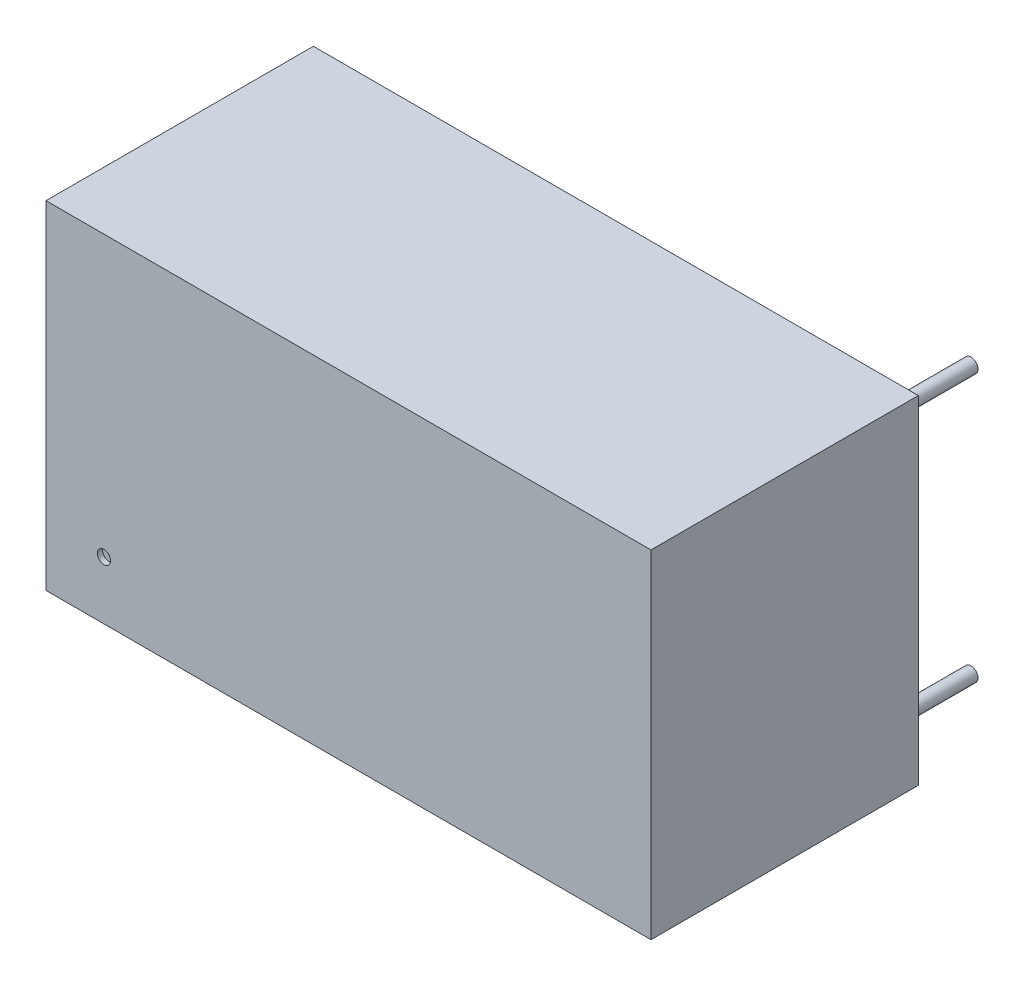
ISO-10303-21;
HEADER;
FILE_DESCRIPTION(('STEP AP214'),'2;1');
FILE_NAME('part.step','',(''),(''),'','','');
FILE_SCHEMA(('AUTOMOTIVE_DESIGN { 1 0 10303 214 1 1 1 1 }'));
ENDSEC;
DATA;
#1=APPLICATION_CONTEXT('core data for automotive mechanical design processes');
#2=APPLICATION_PROTOCOL_DEFINITION('international standard','automotive_design',2000,#1);
#3=PRODUCT_CONTEXT('',#1,'mechanical');
#4=PRODUCT('Part','Part','',(#3));
#5=PRODUCT_RELATED_PRODUCT_CATEGORY('part','',(#4));
#6=PRODUCT_DEFINITION_FORMATION('','',#4);
#7=PRODUCT_DEFINITION_CONTEXT('part definition',#1,'design');
#8=PRODUCT_DEFINITION('design','',#6,#7);
#9=PRODUCT_DEFINITION_SHAPE('','',#8);
#10=(LENGTH_UNIT() NAMED_UNIT(*) SI_UNIT(.MILLI.,.METRE.));
#11=(NAMED_UNIT(*) PLANE_ANGLE_UNIT() SI_UNIT($,.RADIAN.));
#12=(NAMED_UNIT(*) SI_UNIT($,.STERADIAN.) SOLID_ANGLE_UNIT());
#13=UNCERTAINTY_MEASURE_WITH_UNIT(LENGTH_MEASURE(1.E-05),#10,'distance_accuracy_value','');
#14=(GEOMETRIC_REPRESENTATION_CONTEXT(3) GLOBAL_UNCERTAINTY_ASSIGNED_CONTEXT((#13)) GLOBAL_UNIT_ASSIGNED_CONTEXT((#10,
#11,#12)) REPRESENTATION_CONTEXT('',''));
#15=CARTESIAN_POINT('',(0.,0.,0.));
#16=DIRECTION('',(0.,0.,1.));
#17=DIRECTION('',(1.,0.,0.));
#18=AXIS2_PLACEMENT_3D('',#15,#16,#17);
#19=CARTESIAN_POINT('',(0.,0.,15.24));
#20=DIRECTION('',(1.,0.,0.));
#21=DIRECTION('',(0.,0.,-1.));
#22=AXIS2_PLACEMENT_3D('',#19,#20,#21);
#23=PLANE('',#22);
#24=DIRECTION('',(0.,-1.,0.));
#25=VECTOR('',#24,1.);
#26=CARTESIAN_POINT('',(0.,0.,0.));
#27=LINE('',#26,#25);
#28=CARTESIAN_POINT('',(0.,19.24,0.));
#29=VERTEX_POINT('',#28);
#30=CARTESIAN_POINT('',(0.,0.,0.));
#31=VERTEX_POINT('',#30);
#32=EDGE_CURVE('E100',#29,#31,#27,.T.);
#33=ORIENTED_EDGE('',*,*,#32,.T.);
#34=DIRECTION('',(0.,0.,-1.));
#35=VECTOR('',#34,1.);
#36=CARTESIAN_POINT('',(0.,0.,15.24));
#37=LINE('',#36,#35);
#38=CARTESIAN_POINT('',(0.,0.,15.24));
#39=VERTEX_POINT('',#38);
#40=EDGE_CURVE('E11',#39,#31,#37,.T.);
#41=ORIENTED_EDGE('',*,*,#40,.F.);
#42=DIRECTION('',(0.,-1.,0.));
#43=VECTOR('',#42,1.);
#44=CARTESIAN_POINT('',(0.,0.,15.24));
#45=LINE('',#44,#43);
#46=CARTESIAN_POINT('',(0.,19.24,15.24));
#47=VERTEX_POINT('',#46);
#48=EDGE_CURVE('E88',#47,#39,#45,.T.);
#49=ORIENTED_EDGE('',*,*,#48,.F.);
#50=DIRECTION('',(0.,0.,-1.));
#51=VECTOR('',#50,1.);
#52=CARTESIAN_POINT('',(0.,19.24,15.24));
#53=LINE('',#52,#51);
#54=EDGE_CURVE('E96',#47,#29,#53,.T.);
#55=ORIENTED_EDGE('',*,*,#54,.T.);
#56=EDGE_LOOP('',(#33,#41,#49,#55));
#57=FACE_BOUND('',#56,.T.);
#58=ADVANCED_FACE('F37',(#57),#23,.F.);
#59=CARTESIAN_POINT('',(0.,0.,15.24));
#60=DIRECTION('',(0.,1.,0.));
#61=DIRECTION('',(0.,0.,1.));
#62=AXIS2_PLACEMENT_3D('',#59,#60,#61);
#63=PLANE('',#62);
#64=DIRECTION('',(1.,0.,0.));
#65=VECTOR('',#64,1.);
#66=CARTESIAN_POINT('',(0.,0.,0.));
#67=LINE('',#66,#65);
#68=CARTESIAN_POINT('',(34.48,0.,0.));
#69=VERTEX_POINT('',#68);
#70=EDGE_CURVE('E92',#31,#69,#67,.T.);
#71=ORIENTED_EDGE('',*,*,#70,.T.);
#72=DIRECTION('',(0.,0.,-1.));
#73=VECTOR('',#72,1.);
#74=CARTESIAN_POINT('',(34.48,0.,15.24));
#75=LINE('',#74,#73);
#76=CARTESIAN_POINT('',(34.48,0.,15.24));
#77=VERTEX_POINT('',#76);
#78=EDGE_CURVE('E45',#77,#69,#75,.T.);
#79=ORIENTED_EDGE('',*,*,#78,.F.);
#80=DIRECTION('',(1.,0.,0.));
#81=VECTOR('',#80,1.);
#82=CARTESIAN_POINT('',(0.,0.,15.24));
#83=LINE('',#82,#81);
#84=EDGE_CURVE('E83',#39,#77,#83,.T.);
#85=ORIENTED_EDGE('',*,*,#84,.F.);
#86=ORIENTED_EDGE('',*,*,#40,.T.);
#87=EDGE_LOOP('',(#71,#79,#85,#86));
#88=FACE_BOUND('',#87,.T.);
#89=ADVANCED_FACE('F91',(#88),#63,.F.);
#90=CARTESIAN_POINT('',(34.48,0.,15.24));
#91=DIRECTION('',(-1.,0.,0.));
#92=DIRECTION('',(0.,0.,1.));
#93=AXIS2_PLACEMENT_3D('',#90,#91,#92);
#94=PLANE('',#93);
#95=DIRECTION('',(0.,1.,0.));
#96=VECTOR('',#95,1.);
#97=CARTESIAN_POINT('',(34.48,0.,0.));
#98=LINE('',#97,#96);
#99=CARTESIAN_POINT('',(34.48,19.24,0.));
#100=VERTEX_POINT('',#99);
#101=EDGE_CURVE('E70',#69,#100,#98,.T.);
#102=ORIENTED_EDGE('',*,*,#101,.T.);
#103=DIRECTION('',(0.,0.,-1.));
#104=VECTOR('',#103,1.);
#105=CARTESIAN_POINT('',(34.48,19.24,15.24));
#106=LINE('',#105,#104);
#107=CARTESIAN_POINT('',(34.48,19.24,15.24));
#108=VERTEX_POINT('',#107);
#109=EDGE_CURVE('E93',#108,#100,#106,.T.);
#110=ORIENTED_EDGE('',*,*,#109,.F.);
#111=DIRECTION('',(0.,1.,0.));
#112=VECTOR('',#111,1.);
#113=CARTESIAN_POINT('',(34.48,0.,15.24));
#114=LINE('',#113,#112);
#115=EDGE_CURVE('E86',#77,#108,#114,.T.);
#116=ORIENTED_EDGE('',*,*,#115,.F.);
#117=ORIENTED_EDGE('',*,*,#78,.T.);
#118=EDGE_LOOP('',(#102,#110,#116,#117));
#119=FACE_BOUND('',#118,.T.);
#120=ADVANCED_FACE('F94',(#119),#94,.F.);
#121=CARTESIAN_POINT('',(0.,19.24,15.24));
#122=DIRECTION('',(0.,-1.,0.));
#123=DIRECTION('',(0.,0.,-1.));
#124=AXIS2_PLACEMENT_3D('',#121,#122,#123);
#125=PLANE('',#124);
#126=DIRECTION('',(-1.,0.,0.));
#127=VECTOR('',#126,1.);
#128=CARTESIAN_POINT('',(0.,19.24,0.));
#129=LINE('',#128,#127);
#130=EDGE_CURVE('E76',#100,#29,#129,.T.);
#131=ORIENTED_EDGE('',*,*,#130,.T.);
#132=ORIENTED_EDGE('',*,*,#54,.F.);
#133=DIRECTION('',(-1.,0.,0.));
#134=VECTOR('',#133,1.);
#135=CARTESIAN_POINT('',(0.,19.24,15.24));
#136=LINE('',#135,#134);
#137=EDGE_CURVE('E53',#108,#47,#136,.T.);
#138=ORIENTED_EDGE('',*,*,#137,.F.);
#139=ORIENTED_EDGE('',*,*,#109,.T.);
#140=EDGE_LOOP('',(#131,#132,#138,#139));
#141=FACE_BOUND('',#140,.T.);
#142=ADVANCED_FACE('F108',(#141),#125,.F.);
#143=CARTESIAN_POINT('',(0.,0.,15.24));
#144=DIRECTION('',(0.,0.,-1.));
#145=DIRECTION('',(-1.,0.,0.));
#146=AXIS2_PLACEMENT_3D('',#143,#144,#145);
#147=PLANE('',#146);
#148=CARTESIAN_POINT('',(3.3,3.3,15.24));
#149=DIRECTION('',(0.,0.,1.));
#150=DIRECTION('',(1.,0.,0.));
#151=AXIS2_PLACEMENT_3D('',#148,#149,#150);
#152=CIRCLE('',#151,0.375);
#153=CARTESIAN_POINT('',(3.675,3.3,15.24));
#154=VERTEX_POINT('',#153);
#155=EDGE_CURVE('E114',#154,#154,#152,.T.);
#156=ORIENTED_EDGE('',*,*,#155,.F.);
#157=EDGE_LOOP('',(#156));
#158=FACE_BOUND('',#157,.T.);
#159=ORIENTED_EDGE('',*,*,#48,.T.);
#160=ORIENTED_EDGE('',*,*,#84,.T.);
#161=ORIENTED_EDGE('',*,*,#115,.T.);
#162=ORIENTED_EDGE('',*,*,#137,.T.);
#163=EDGE_LOOP('',(#159,#160,#161,#162));
#164=FACE_BOUND('',#163,.T.);
#165=ADVANCED_FACE('F84',(#158,#164),#147,.F.);
#166=CARTESIAN_POINT('',(0.,0.,0.));
#167=DIRECTION('',(0.,0.,-1.));
#168=DIRECTION('',(-1.,0.,0.));
#169=AXIS2_PLACEMENT_3D('',#166,#167,#168);
#170=PLANE('',#169);
#171=CARTESIAN_POINT('',(2.,7.08,0.));
#172=DIRECTION('',(0.,0.,-1.));
#173=DIRECTION('',(-1.,0.,0.));
#174=AXIS2_PLACEMENT_3D('',#171,#172,#173);
#175=CIRCLE('',#174,0.4);
#176=CARTESIAN_POINT('',(1.6,7.08,0.));
#177=VERTEX_POINT('',#176);
#178=EDGE_CURVE('E138',#177,#177,#175,.T.);
#179=ORIENTED_EDGE('',*,*,#178,.F.);
#180=EDGE_LOOP('',(#179));
#181=FACE_BOUND('',#180,.T.);
#182=CARTESIAN_POINT('',(2.,12.16,0.));
#183=DIRECTION('',(0.,0.,-1.));
#184=DIRECTION('',(-1.,0.,0.));
#185=AXIS2_PLACEMENT_3D('',#182,#183,#184);
#186=CIRCLE('',#185,0.399999999999999);
#187=CARTESIAN_POINT('',(1.6,12.16,0.));
#188=VERTEX_POINT('',#187);
#189=EDGE_CURVE('E132',#188,#188,#186,.T.);
#190=ORIENTED_EDGE('',*,*,#189,.F.);
#191=EDGE_LOOP('',(#190));
#192=FACE_BOUND('',#191,.T.);
#193=CARTESIAN_POINT('',(32.48,2.,0.));
#194=DIRECTION('',(0.,0.,-1.));
#195=DIRECTION('',(-1.,0.,0.));
#196=AXIS2_PLACEMENT_3D('',#193,#194,#195);
#197=CIRCLE('',#196,0.399999999999998);
#198=CARTESIAN_POINT('',(32.08,2.,0.));
#199=VERTEX_POINT('',#198);
#200=EDGE_CURVE('E126',#199,#199,#197,.T.);
#201=ORIENTED_EDGE('',*,*,#200,.F.);
#202=EDGE_LOOP('',(#201));
#203=FACE_BOUND('',#202,.T.);
#204=CARTESIAN_POINT('',(32.48,17.24,0.));
#205=DIRECTION('',(0.,0.,-1.));
#206=DIRECTION('',(-1.,0.,0.));
#207=AXIS2_PLACEMENT_3D('',#204,#205,#206);
#208=CIRCLE('',#207,0.399999999999998);
#209=CARTESIAN_POINT('',(32.08,17.24,0.));
#210=VERTEX_POINT('',#209);
#211=EDGE_CURVE('E120',#210,#210,#208,.T.);
#212=ORIENTED_EDGE('',*,*,#211,.F.);
#213=EDGE_LOOP('',(#212));
#214=FACE_BOUND('',#213,.T.);
#215=ORIENTED_EDGE('',*,*,#32,.F.);
#216=ORIENTED_EDGE('',*,*,#130,.F.);
#217=ORIENTED_EDGE('',*,*,#101,.F.);
#218=ORIENTED_EDGE('',*,*,#70,.F.);
#219=EDGE_LOOP('',(#215,#216,#217,#218));
#220=FACE_BOUND('',#219,.T.);
#221=ADVANCED_FACE('F111',(#181,#192,#203,#214,#220),#170,.T.);
#222=CARTESIAN_POINT('',(3.3,3.3,14.94));
#223=DIRECTION('',(0.,0.,1.));
#224=DIRECTION('',(1.,0.,0.));
#225=AXIS2_PLACEMENT_3D('',#222,#223,#224);
#226=CYLINDRICAL_SURFACE('',#225,0.375);
#227=CARTESIAN_POINT('',(3.3,3.3,14.94));
#228=DIRECTION('',(0.,0.,1.));
#229=DIRECTION('',(1.,0.,0.));
#230=AXIS2_PLACEMENT_3D('',#227,#228,#229);
#231=CIRCLE('',#230,0.375);
#232=CARTESIAN_POINT('',(3.675,3.3,14.94));
#233=VERTEX_POINT('',#232);
#234=EDGE_CURVE('E103',#233,#233,#231,.T.);
#235=ORIENTED_EDGE('',*,*,#234,.F.);
#236=EDGE_LOOP('',(#235));
#237=FACE_BOUND('',#236,.T.);
#238=ORIENTED_EDGE('',*,*,#155,.T.);
#239=EDGE_LOOP('',(#238));
#240=FACE_BOUND('',#239,.T.);
#241=ADVANCED_FACE('F155',(#237,#240),#226,.F.);
#242=CARTESIAN_POINT('',(3.3,3.3,14.94));
#243=DIRECTION('',(0.,0.,1.));
#244=DIRECTION('',(1.,0.,0.));
#245=AXIS2_PLACEMENT_3D('',#242,#243,#244);
#246=PLANE('',#245);
#247=ORIENTED_EDGE('',*,*,#234,.T.);
#248=EDGE_LOOP('',(#247));
#249=FACE_BOUND('',#248,.T.);
#250=ADVANCED_FACE('F166',(#249),#246,.T.);
#251=CARTESIAN_POINT('',(32.48,17.24,-5.));
#252=DIRECTION('',(0.,0.,1.));
#253=DIRECTION('',(1.,0.,0.));
#254=AXIS2_PLACEMENT_3D('',#251,#252,#253);
#255=CYLINDRICAL_SURFACE('',#254,0.399999999999998);
#256=CARTESIAN_POINT('',(32.48,17.24,-5.));
#257=DIRECTION('',(0.,0.,-1.));
#258=DIRECTION('',(-1.,0.,0.));
#259=AXIS2_PLACEMENT_3D('',#256,#257,#258);
#260=CIRCLE('',#259,0.399999999999998);
#261=CARTESIAN_POINT('',(32.08,17.24,-5.));
#262=VERTEX_POINT('',#261);
#263=EDGE_CURVE('E117',#262,#262,#260,.T.);
#264=ORIENTED_EDGE('',*,*,#263,.F.);
#265=EDGE_LOOP('',(#264));
#266=FACE_BOUND('',#265,.T.);
#267=ORIENTED_EDGE('',*,*,#211,.T.);
#268=EDGE_LOOP('',(#267));
#269=FACE_BOUND('',#268,.T.);
#270=ADVANCED_FACE('F163',(#266,#269),#255,.T.);
#271=CARTESIAN_POINT('',(32.48,17.24,-5.));
#272=DIRECTION('',(0.,0.,-1.));
#273=DIRECTION('',(-1.,0.,0.));
#274=AXIS2_PLACEMENT_3D('',#271,#272,#273);
#275=PLANE('',#274);
#276=ORIENTED_EDGE('',*,*,#263,.T.);
#277=EDGE_LOOP('',(#276));
#278=FACE_BOUND('',#277,.T.);
#279=ADVANCED_FACE('F165',(#278),#275,.T.);
#280=CARTESIAN_POINT('',(32.48,2.,-5.));
#281=DIRECTION('',(0.,0.,1.));
#282=DIRECTION('',(1.,0.,0.));
#283=AXIS2_PLACEMENT_3D('',#280,#281,#282);
#284=CYLINDRICAL_SURFACE('',#283,0.399999999999998);
#285=CARTESIAN_POINT('',(32.48,2.,-5.));
#286=DIRECTION('',(0.,0.,-1.));
#287=DIRECTION('',(-1.,0.,0.));
#288=AXIS2_PLACEMENT_3D('',#285,#286,#287);
#289=CIRCLE('',#288,0.399999999999998);
#290=CARTESIAN_POINT('',(32.08,2.,-5.));
#291=VERTEX_POINT('',#290);
#292=EDGE_CURVE('E123',#291,#291,#289,.T.);
#293=ORIENTED_EDGE('',*,*,#292,.F.);
#294=EDGE_LOOP('',(#293));
#295=FACE_BOUND('',#294,.T.);
#296=ORIENTED_EDGE('',*,*,#200,.T.);
#297=EDGE_LOOP('',(#296));
#298=FACE_BOUND('',#297,.T.);
#299=ADVANCED_FACE('F173',(#295,#298),#284,.T.);
#300=CARTESIAN_POINT('',(32.48,2.,-5.));
#301=DIRECTION('',(0.,0.,-1.));
#302=DIRECTION('',(-1.,0.,0.));
#303=AXIS2_PLACEMENT_3D('',#300,#301,#302);
#304=PLANE('',#303);
#305=ORIENTED_EDGE('',*,*,#292,.T.);
#306=EDGE_LOOP('',(#305));
#307=FACE_BOUND('',#306,.T.);
#308=ADVANCED_FACE('F231',(#307),#304,.T.);
#309=CARTESIAN_POINT('',(2.,12.16,-5.));
#310=DIRECTION('',(0.,0.,1.));
#311=DIRECTION('',(1.,0.,0.));
#312=AXIS2_PLACEMENT_3D('',#309,#310,#311);
#313=CYLINDRICAL_SURFACE('',#312,0.399999999999999);
#314=CARTESIAN_POINT('',(2.,12.16,-5.));
#315=DIRECTION('',(0.,0.,-1.));
#316=DIRECTION('',(-1.,0.,0.));
#317=AXIS2_PLACEMENT_3D('',#314,#315,#316);
#318=CIRCLE('',#317,0.399999999999999);
#319=CARTESIAN_POINT('',(1.6,12.16,-5.));
#320=VERTEX_POINT('',#319);
#321=EDGE_CURVE('E129',#320,#320,#318,.T.);
#322=ORIENTED_EDGE('',*,*,#321,.F.);
#323=EDGE_LOOP('',(#322));
#324=FACE_BOUND('',#323,.T.);
#325=ORIENTED_EDGE('',*,*,#189,.T.);
#326=EDGE_LOOP('',(#325));
#327=FACE_BOUND('',#326,.T.);
#328=ADVANCED_FACE('F241',(#324,#327),#313,.T.);
#329=CARTESIAN_POINT('',(2.,12.16,-5.));
#330=DIRECTION('',(0.,0.,-1.));
#331=DIRECTION('',(-1.,0.,0.));
#332=AXIS2_PLACEMENT_3D('',#329,#330,#331);
#333=PLANE('',#332);
#334=ORIENTED_EDGE('',*,*,#321,.T.);
#335=EDGE_LOOP('',(#334));
#336=FACE_BOUND('',#335,.T.);
#337=ADVANCED_FACE('F149',(#336),#333,.T.);
#338=CARTESIAN_POINT('',(2.,7.08,-5.));
#339=DIRECTION('',(0.,0.,1.));
#340=DIRECTION('',(1.,0.,0.));
#341=AXIS2_PLACEMENT_3D('',#338,#339,#340);
#342=CYLINDRICAL_SURFACE('',#341,0.4);
#343=CARTESIAN_POINT('',(2.,7.08,-5.));
#344=DIRECTION('',(0.,0.,-1.));
#345=DIRECTION('',(-1.,0.,0.));
#346=AXIS2_PLACEMENT_3D('',#343,#344,#345);
#347=CIRCLE('',#346,0.4);
#348=CARTESIAN_POINT('',(1.6,7.08,-5.));
#349=VERTEX_POINT('',#348);
#350=EDGE_CURVE('E135',#349,#349,#347,.T.);
#351=ORIENTED_EDGE('',*,*,#350,.F.);
#352=EDGE_LOOP('',(#351));
#353=FACE_BOUND('',#352,.T.);
#354=ORIENTED_EDGE('',*,*,#178,.T.);
#355=EDGE_LOOP('',(#354));
#356=FACE_BOUND('',#355,.T.);
#357=ADVANCED_FACE('F146',(#353,#356),#342,.T.);
#358=CARTESIAN_POINT('',(2.,7.08,-5.));
#359=DIRECTION('',(0.,0.,-1.));
#360=DIRECTION('',(-1.,0.,0.));
#361=AXIS2_PLACEMENT_3D('',#358,#359,#360);
#362=PLANE('',#361);
#363=ORIENTED_EDGE('',*,*,#350,.T.);
#364=EDGE_LOOP('',(#363));
#365=FACE_BOUND('',#364,.T.);
#366=ADVANCED_FACE('F144',(#365),#362,.T.);
#367=CLOSED_SHELL('',(#58,#89,#120,#142,#165,#221,#241,#250,#270,#279,#299,#308,#328,#337,#357,#366));
#368=MANIFOLD_SOLID_BREP('B2',#367);
#369=ADVANCED_BREP_SHAPE_REPRESENTATION('',(#18,#368),#14);
#370=SHAPE_DEFINITION_REPRESENTATION(#9,#369);
ENDSEC;
END-ISO-10303-21;
